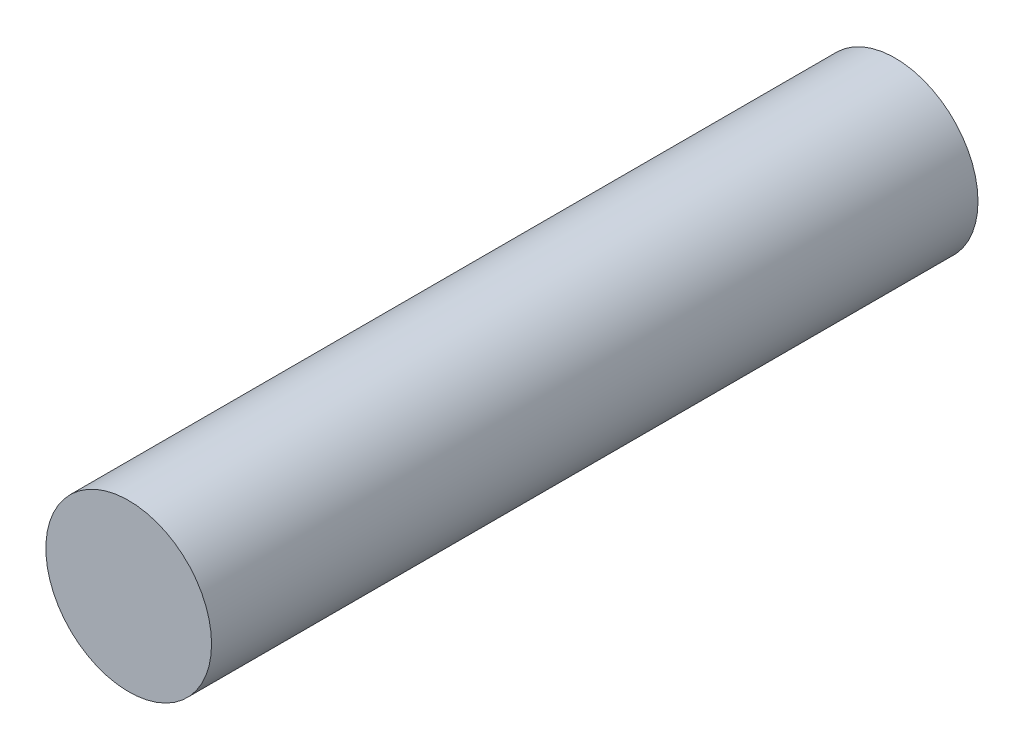
ISO-10303-21;
HEADER;
FILE_DESCRIPTION(('STEP AP214'),'2;1');
FILE_NAME('part.step','',(''),(''),'','','');
FILE_SCHEMA(('AUTOMOTIVE_DESIGN { 1 0 10303 214 1 1 1 1 }'));
ENDSEC;
DATA;
#1=APPLICATION_CONTEXT('core data for automotive mechanical design processes');
#2=APPLICATION_PROTOCOL_DEFINITION('international standard','automotive_design',2000,#1);
#3=PRODUCT_CONTEXT('',#1,'mechanical');
#4=PRODUCT('Part','Part','',(#3));
#5=PRODUCT_RELATED_PRODUCT_CATEGORY('part','',(#4));
#6=PRODUCT_DEFINITION_FORMATION('','',#4);
#7=PRODUCT_DEFINITION_CONTEXT('part definition',#1,'design');
#8=PRODUCT_DEFINITION('design','',#6,#7);
#9=PRODUCT_DEFINITION_SHAPE('','',#8);
#10=(LENGTH_UNIT() NAMED_UNIT(*) SI_UNIT(.MILLI.,.METRE.));
#11=(NAMED_UNIT(*) PLANE_ANGLE_UNIT() SI_UNIT($,.RADIAN.));
#12=(NAMED_UNIT(*) SI_UNIT($,.STERADIAN.) SOLID_ANGLE_UNIT());
#13=UNCERTAINTY_MEASURE_WITH_UNIT(LENGTH_MEASURE(1.E-05),#10,'distance_accuracy_value','');
#14=(GEOMETRIC_REPRESENTATION_CONTEXT(3) GLOBAL_UNCERTAINTY_ASSIGNED_CONTEXT((#13)) GLOBAL_UNIT_ASSIGNED_CONTEXT((#10,
#11,#12)) REPRESENTATION_CONTEXT('',''));
#15=CARTESIAN_POINT('',(0.,0.,0.));
#16=DIRECTION('',(0.,0.,1.));
#17=DIRECTION('',(1.,0.,0.));
#18=AXIS2_PLACEMENT_3D('',#15,#16,#17);
#19=CARTESIAN_POINT('',(0.,0.,37.));
#20=DIRECTION('',(0.,0.,-1.));
#21=DIRECTION('',(-1.,0.,0.));
#22=AXIS2_PLACEMENT_3D('',#19,#20,#21);
#23=CYLINDRICAL_SURFACE('',#22,4.);
#24=CARTESIAN_POINT('',(0.,0.,37.));
#25=DIRECTION('',(0.,0.,1.));
#26=DIRECTION('',(1.,0.,0.));
#27=AXIS2_PLACEMENT_3D('',#24,#25,#26);
#28=CIRCLE('',#27,4.);
#29=CARTESIAN_POINT('',(4.,0.,37.));
#30=VERTEX_POINT('',#29);
#31=EDGE_CURVE('E10',#30,#30,#28,.T.);
#32=ORIENTED_EDGE('',*,*,#31,.F.);
#33=EDGE_LOOP('',(#32));
#34=FACE_BOUND('',#33,.T.);
#35=CARTESIAN_POINT('',(0.,0.,0.));
#36=DIRECTION('',(0.,0.,1.));
#37=DIRECTION('',(1.,0.,0.));
#38=AXIS2_PLACEMENT_3D('',#35,#36,#37);
#39=CIRCLE('',#38,4.);
#40=CARTESIAN_POINT('',(4.,0.,0.));
#41=VERTEX_POINT('',#40);
#42=EDGE_CURVE('E40',#41,#41,#39,.T.);
#43=ORIENTED_EDGE('',*,*,#42,.T.);
#44=EDGE_LOOP('',(#43));
#45=FACE_BOUND('',#44,.T.);
#46=ADVANCED_FACE('F37',(#34,#45),#23,.T.);
#47=CARTESIAN_POINT('',(0.,0.,37.));
#48=DIRECTION('',(0.,0.,1.));
#49=DIRECTION('',(1.,0.,0.));
#50=AXIS2_PLACEMENT_3D('',#47,#48,#49);
#51=PLANE('',#50);
#52=ORIENTED_EDGE('',*,*,#31,.T.);
#53=EDGE_LOOP('',(#52));
#54=FACE_BOUND('',#53,.T.);
#55=ADVANCED_FACE('F54',(#54),#51,.T.);
#56=CARTESIAN_POINT('',(0.,0.,0.));
#57=DIRECTION('',(0.,0.,1.));
#58=DIRECTION('',(1.,0.,0.));
#59=AXIS2_PLACEMENT_3D('',#56,#57,#58);
#60=PLANE('',#59);
#61=ORIENTED_EDGE('',*,*,#42,.F.);
#62=EDGE_LOOP('',(#61));
#63=FACE_BOUND('',#62,.T.);
#64=ADVANCED_FACE('F52',(#63),#60,.F.);
#65=CLOSED_SHELL('',(#46,#55,#64));
#66=MANIFOLD_SOLID_BREP('B2',#65);
#67=ADVANCED_BREP_SHAPE_REPRESENTATION('',(#18,#66),#14);
#68=SHAPE_DEFINITION_REPRESENTATION(#9,#67);
ENDSEC;
END-ISO-10303-21;
